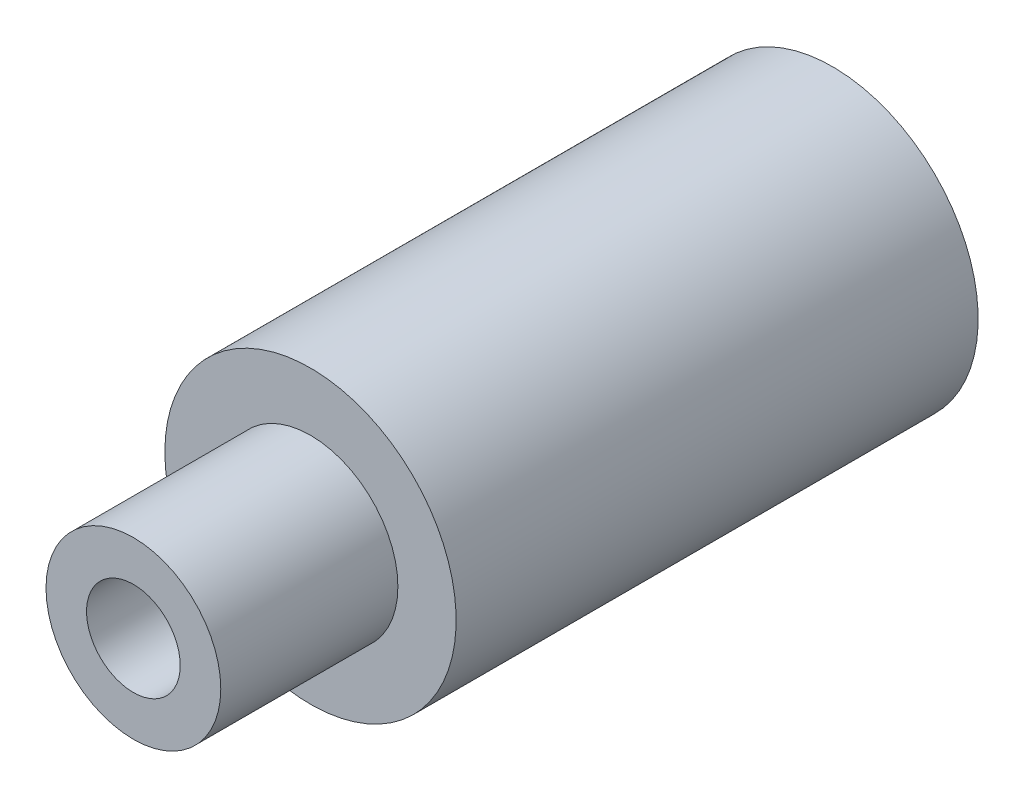
ISO-10303-21;
HEADER;
FILE_DESCRIPTION(('STEP AP214'),'2;1');
FILE_NAME('part.step','',(''),(''),'','','');
FILE_SCHEMA(('AUTOMOTIVE_DESIGN { 1 0 10303 214 1 1 1 1 }'));
ENDSEC;
DATA;
#1=APPLICATION_CONTEXT('core data for automotive mechanical design processes');
#2=APPLICATION_PROTOCOL_DEFINITION('international standard','automotive_design',2000,#1);
#3=PRODUCT_CONTEXT('',#1,'mechanical');
#4=PRODUCT('Part','Part','',(#3));
#5=PRODUCT_RELATED_PRODUCT_CATEGORY('part','',(#4));
#6=PRODUCT_DEFINITION_FORMATION('','',#4);
#7=PRODUCT_DEFINITION_CONTEXT('part definition',#1,'design');
#8=PRODUCT_DEFINITION('design','',#6,#7);
#9=PRODUCT_DEFINITION_SHAPE('','',#8);
#10=(LENGTH_UNIT() NAMED_UNIT(*) SI_UNIT(.MILLI.,.METRE.));
#11=(NAMED_UNIT(*) PLANE_ANGLE_UNIT() SI_UNIT($,.RADIAN.));
#12=(NAMED_UNIT(*) SI_UNIT($,.STERADIAN.) SOLID_ANGLE_UNIT());
#13=UNCERTAINTY_MEASURE_WITH_UNIT(LENGTH_MEASURE(1.E-05),#10,'distance_accuracy_value','');
#14=(GEOMETRIC_REPRESENTATION_CONTEXT(3) GLOBAL_UNCERTAINTY_ASSIGNED_CONTEXT((#13)) GLOBAL_UNIT_ASSIGNED_CONTEXT((#10,
#11,#12)) REPRESENTATION_CONTEXT('',''));
#15=CARTESIAN_POINT('',(0.,0.,0.));
#16=DIRECTION('',(0.,0.,1.));
#17=DIRECTION('',(1.,0.,0.));
#18=AXIS2_PLACEMENT_3D('',#15,#16,#17);
#19=CARTESIAN_POINT('',(0.,0.,38.1));
#20=DIRECTION('',(0.,0.,-1.));
#21=DIRECTION('',(-1.,0.,0.));
#22=AXIS2_PLACEMENT_3D('',#19,#20,#21);
#23=CYLINDRICAL_SURFACE('',#22,7.9375);
#24=CARTESIAN_POINT('',(0.,0.,0.));
#25=DIRECTION('',(0.,0.,1.));
#26=DIRECTION('',(1.,0.,0.));
#27=AXIS2_PLACEMENT_3D('',#24,#25,#26);
#28=CIRCLE('',#27,7.9375);
#29=CARTESIAN_POINT('',(-7.9375,0.,0.));
#30=VERTEX_POINT('',#29);
#31=EDGE_CURVE('E11',#30,#30,#28,.T.);
#32=CARTESIAN_POINT('',(0.,0.,28.448));
#33=DIRECTION('',(0.,0.,1.));
#34=DIRECTION('',(1.,0.,0.));
#35=AXIS2_PLACEMENT_3D('',#32,#33,#34);
#36=CIRCLE('',#35,7.9375);
#37=CARTESIAN_POINT('',(-7.9375,0.,28.448));
#38=VERTEX_POINT('',#37);
#39=EDGE_CURVE('E46',#38,#38,#36,.T.);
#40=CARTESIAN_POINT('',(-7.9375,0.,0.));
#41=CARTESIAN_POINT('',(-7.9375,0.,0.296333333333334));
#42=CARTESIAN_POINT('',(-7.9375,0.,0.592666666666667));
#43=CARTESIAN_POINT('',(-7.9375,0.,1.18533333333333));
#44=CARTESIAN_POINT('',(-7.9375,0.,1.48166666666667));
#45=CARTESIAN_POINT('',(-7.9375,0.,2.07433333333334));
#46=CARTESIAN_POINT('',(-7.9375,0.,2.37066666666667));
#47=CARTESIAN_POINT('',(-7.9375,0.,2.96333333333334));
#48=CARTESIAN_POINT('',(-7.9375,0.,3.25966666666667));
#49=CARTESIAN_POINT('',(-7.9375,0.,3.85233333333334));
#50=CARTESIAN_POINT('',(-7.9375,0.,4.14866666666667));
#51=CARTESIAN_POINT('',(-7.9375,0.,4.74133333333334));
#52=CARTESIAN_POINT('',(-7.9375,0.,5.03766666666667));
#53=CARTESIAN_POINT('',(-7.9375,0.,5.63033333333333));
#54=CARTESIAN_POINT('',(-7.9375,0.,5.92666666666667));
#55=CARTESIAN_POINT('',(-7.9375,0.,6.51933333333333));
#56=CARTESIAN_POINT('',(-7.9375,0.,6.81566666666666));
#57=CARTESIAN_POINT('',(-7.9375,0.,7.40833333333333));
#58=CARTESIAN_POINT('',(-7.9375,0.,7.70466666666666));
#59=CARTESIAN_POINT('',(-7.9375,0.,8.29733333333333));
#60=CARTESIAN_POINT('',(-7.9375,0.,8.59366666666666));
#61=CARTESIAN_POINT('',(-7.9375,0.,9.18633333333333));
#62=CARTESIAN_POINT('',(-7.9375,0.,9.48266666666667));
#63=CARTESIAN_POINT('',(-7.9375,0.,10.0753333333333));
#64=CARTESIAN_POINT('',(-7.9375,0.,10.3716666666667));
#65=CARTESIAN_POINT('',(-7.9375,0.,10.9643333333333));
#66=CARTESIAN_POINT('',(-7.9375,0.,11.2606666666667));
#67=CARTESIAN_POINT('',(-7.9375,0.,11.8533333333333));
#68=CARTESIAN_POINT('',(-7.9375,0.,12.1496666666667));
#69=CARTESIAN_POINT('',(-7.9375,0.,12.7423333333333));
#70=CARTESIAN_POINT('',(-7.9375,0.,13.0386666666667));
#71=CARTESIAN_POINT('',(-7.9375,0.,13.6313333333333));
#72=CARTESIAN_POINT('',(-7.9375,0.,13.9276666666667));
#73=CARTESIAN_POINT('',(-7.9375,0.,14.5203333333333));
#74=CARTESIAN_POINT('',(-7.9375,0.,14.8166666666667));
#75=CARTESIAN_POINT('',(-7.9375,0.,15.4093333333333));
#76=CARTESIAN_POINT('',(-7.9375,0.,15.7056666666667));
#77=CARTESIAN_POINT('',(-7.9375,0.,16.2983333333333));
#78=CARTESIAN_POINT('',(-7.9375,0.,16.5946666666667));
#79=CARTESIAN_POINT('',(-7.9375,0.,17.1873333333333));
#80=CARTESIAN_POINT('',(-7.9375,0.,17.4836666666667));
#81=CARTESIAN_POINT('',(-7.9375,0.,18.0763333333333));
#82=CARTESIAN_POINT('',(-7.9375,0.,18.3726666666667));
#83=CARTESIAN_POINT('',(-7.9375,0.,18.9653333333333));
#84=CARTESIAN_POINT('',(-7.9375,0.,19.2616666666667));
#85=CARTESIAN_POINT('',(-7.9375,0.,19.8543333333333));
#86=CARTESIAN_POINT('',(-7.9375,0.,20.1506666666667));
#87=CARTESIAN_POINT('',(-7.9375,0.,20.7433333333333));
#88=CARTESIAN_POINT('',(-7.9375,0.,21.0396666666667));
#89=CARTESIAN_POINT('',(-7.9375,0.,21.6323333333333));
#90=CARTESIAN_POINT('',(-7.9375,0.,21.9286666666667));
#91=CARTESIAN_POINT('',(-7.9375,0.,22.5213333333333));
#92=CARTESIAN_POINT('',(-7.9375,0.,22.8176666666667));
#93=CARTESIAN_POINT('',(-7.9375,0.,23.4103333333333));
#94=CARTESIAN_POINT('',(-7.9375,0.,23.7066666666667));
#95=CARTESIAN_POINT('',(-7.9375,0.,24.2993333333333));
#96=CARTESIAN_POINT('',(-7.9375,0.,24.5956666666667));
#97=CARTESIAN_POINT('',(-7.9375,0.,25.1883333333333));
#98=CARTESIAN_POINT('',(-7.9375,0.,25.4846666666667));
#99=CARTESIAN_POINT('',(-7.9375,0.,26.0773333333333));
#100=CARTESIAN_POINT('',(-7.9375,0.,26.3736666666667));
#101=CARTESIAN_POINT('',(-7.9375,0.,26.9663333333333));
#102=CARTESIAN_POINT('',(-7.9375,0.,27.2626666666667));
#103=CARTESIAN_POINT('',(-7.9375,0.,27.8553333333333));
#104=CARTESIAN_POINT('',(-7.9375,0.,28.1516666666667));
#105=CARTESIAN_POINT('',(-7.9375,0.,28.448));
#106=B_SPLINE_CURVE_WITH_KNOTS('',3,(#40,#41,#42,#43,#44,#45,#46,#47,#48,#49,#50,#51,#52,#53,
#54,#55,#56,#57,#58,#59,#60,#61,#62,#63,#64,#65,#66,#67,#68,#69,#70,#71,#72,#73,#74,#75,#76,#77,
#78,#79,#80,#81,#82,#83,#84,#85,#86,#87,#88,#89,#90,#91,#92,#93,#94,#95,#96,#97,#98,#99,#100,
#101,#102,#103,#104,#105),.UNSPECIFIED.,.F.,.F.,(4,2,2,2,2,2,2,2,2,2,2,2,2,2,2,2,2,2,2,2,2,2,2,
2,2,2,2,2,2,2,2,2,4),(0.,0.889000000000001,1.778,2.667,3.556,4.445,5.334,6.223,7.112,8.001,8.89,
9.779,10.668,11.557,12.446,13.335,14.224,15.113,16.002,16.891,17.78,18.669,19.558,20.447,21.336,
22.225,23.114,24.003,24.892,25.781,26.67,27.559,28.448),.UNSPECIFIED.);
#107=EDGE_CURVE('BSEAM43',#30,#38,#106,.T.);
#108=ORIENTED_EDGE('',*,*,#31,.T.);
#109=ORIENTED_EDGE('',*,*,#39,.F.);
#110=ORIENTED_EDGE('',*,*,#107,.T.);
#111=ORIENTED_EDGE('',*,*,#107,.F.);
#112=EDGE_LOOP('',(#108,#110,#109,#111));
#113=FACE_BOUND('',#112,.T.);
#114=ADVANCED_FACE('F43',(#113),#23,.T.);
#115=CARTESIAN_POINT('',(0.,0.,0.));
#116=DIRECTION('',(0.,0.,1.));
#117=DIRECTION('',(1.,0.,0.));
#118=AXIS2_PLACEMENT_3D('',#115,#116,#117);
#119=PLANE('',#118);
#120=CARTESIAN_POINT('',(0.,0.,0.));
#121=DIRECTION('',(0.,0.,-1.));
#122=DIRECTION('',(-1.,0.,0.));
#123=AXIS2_PLACEMENT_3D('',#120,#121,#122);
#124=CIRCLE('',#123,2.55269999999999);
#125=CARTESIAN_POINT('',(-2.55269999999999,0.,0.));
#126=VERTEX_POINT('',#125);
#127=EDGE_CURVE('E74',#126,#126,#124,.T.);
#128=ORIENTED_EDGE('',*,*,#127,.F.);
#129=EDGE_LOOP('',(#128));
#130=FACE_BOUND('',#129,.T.);
#131=ORIENTED_EDGE('',*,*,#31,.F.);
#132=EDGE_LOOP('',(#131));
#133=FACE_BOUND('',#132,.T.);
#134=ADVANCED_FACE('F86',(#130,#133),#119,.F.);
#135=CARTESIAN_POINT('',(0.,0.,28.448));
#136=DIRECTION('',(0.,0.,1.));
#137=DIRECTION('',(1.,0.,0.));
#138=AXIS2_PLACEMENT_3D('',#135,#136,#137);
#139=PLANE('',#138);
#140=CARTESIAN_POINT('',(0.,0.,28.448));
#141=DIRECTION('',(0.,0.,1.));
#142=DIRECTION('',(1.,0.,0.));
#143=AXIS2_PLACEMENT_3D('',#140,#141,#142);
#144=CIRCLE('',#143,4.7625);
#145=CARTESIAN_POINT('',(-4.7625,0.,28.448));
#146=VERTEX_POINT('',#145);
#147=EDGE_CURVE('E59',#146,#146,#144,.T.);
#148=ORIENTED_EDGE('',*,*,#147,.F.);
#149=EDGE_LOOP('',(#148));
#150=FACE_BOUND('',#149,.T.);
#151=ORIENTED_EDGE('',*,*,#39,.T.);
#152=EDGE_LOOP('',(#151));
#153=FACE_BOUND('',#152,.T.);
#154=ADVANCED_FACE('F89',(#150,#153),#139,.T.);
#155=CARTESIAN_POINT('',(0.,0.,38.100012));
#156=DIRECTION('',(0.,0.,-1.));
#157=DIRECTION('',(-1.,0.,0.));
#158=AXIS2_PLACEMENT_3D('',#155,#156,#157);
#159=CYLINDRICAL_SURFACE('',#158,4.7625);
#160=CARTESIAN_POINT('',(0.,0.,38.1));
#161=DIRECTION('',(0.,0.,1.));
#162=DIRECTION('',(1.,0.,0.));
#163=AXIS2_PLACEMENT_3D('',#160,#161,#162);
#164=CIRCLE('',#163,4.7625);
#165=CARTESIAN_POINT('',(-4.7625,0.,38.1));
#166=VERTEX_POINT('',#165);
#167=EDGE_CURVE('E57',#166,#166,#164,.F.);
#168=CARTESIAN_POINT('',(-4.7625,0.,38.1));
#169=CARTESIAN_POINT('',(-4.7625,0.,37.9994583333333));
#170=CARTESIAN_POINT('',(-4.7625,0.,37.8989166666667));
#171=CARTESIAN_POINT('',(-4.7625,0.,37.6978333333333));
#172=CARTESIAN_POINT('',(-4.7625,0.,37.5972916666667));
#173=CARTESIAN_POINT('',(-4.7625,0.,37.3962083333333));
#174=CARTESIAN_POINT('',(-4.7625,0.,37.2956666666667));
#175=CARTESIAN_POINT('',(-4.7625,0.,37.0945833333333));
#176=CARTESIAN_POINT('',(-4.7625,0.,36.9940416666667));
#177=CARTESIAN_POINT('',(-4.7625,0.,36.7929583333333));
#178=CARTESIAN_POINT('',(-4.7625,0.,36.6924166666667));
#179=CARTESIAN_POINT('',(-4.7625,0.,36.4913333333333));
#180=CARTESIAN_POINT('',(-4.7625,0.,36.3907916666667));
#181=CARTESIAN_POINT('',(-4.7625,0.,36.1897083333333));
#182=CARTESIAN_POINT('',(-4.7625,0.,36.0891666666667));
#183=CARTESIAN_POINT('',(-4.7625,0.,35.8880833333333));
#184=CARTESIAN_POINT('',(-4.7625,0.,35.7875416666667));
#185=CARTESIAN_POINT('',(-4.7625,0.,35.5864583333333));
#186=CARTESIAN_POINT('',(-4.7625,0.,35.4859166666667));
#187=CARTESIAN_POINT('',(-4.7625,0.,35.2848333333333));
#188=CARTESIAN_POINT('',(-4.7625,0.,35.1842916666667));
#189=CARTESIAN_POINT('',(-4.7625,0.,34.9832083333333));
#190=CARTESIAN_POINT('',(-4.7625,0.,34.8826666666667));
#191=CARTESIAN_POINT('',(-4.7625,0.,34.6815833333333));
#192=CARTESIAN_POINT('',(-4.7625,0.,34.5810416666667));
#193=CARTESIAN_POINT('',(-4.7625,0.,34.3799583333333));
#194=CARTESIAN_POINT('',(-4.7625,0.,34.2794166666667));
#195=CARTESIAN_POINT('',(-4.7625,0.,34.0783333333333));
#196=CARTESIAN_POINT('',(-4.7625,0.,33.9777916666667));
#197=CARTESIAN_POINT('',(-4.7625,0.,33.7767083333333));
#198=CARTESIAN_POINT('',(-4.7625,0.,33.6761666666667));
#199=CARTESIAN_POINT('',(-4.7625,0.,33.4750833333333));
#200=CARTESIAN_POINT('',(-4.7625,0.,33.3745416666667));
#201=CARTESIAN_POINT('',(-4.7625,0.,33.1734583333333));
#202=CARTESIAN_POINT('',(-4.7625,0.,33.0729166666667));
#203=CARTESIAN_POINT('',(-4.7625,0.,32.8718333333333));
#204=CARTESIAN_POINT('',(-4.7625,0.,32.7712916666667));
#205=CARTESIAN_POINT('',(-4.7625,0.,32.5702083333333));
#206=CARTESIAN_POINT('',(-4.7625,0.,32.4696666666667));
#207=CARTESIAN_POINT('',(-4.7625,0.,32.2685833333333));
#208=CARTESIAN_POINT('',(-4.7625,0.,32.1680416666667));
#209=CARTESIAN_POINT('',(-4.7625,0.,31.9669583333333));
#210=CARTESIAN_POINT('',(-4.7625,0.,31.8664166666667));
#211=CARTESIAN_POINT('',(-4.7625,0.,31.6653333333333));
#212=CARTESIAN_POINT('',(-4.7625,0.,31.5647916666667));
#213=CARTESIAN_POINT('',(-4.7625,0.,31.3637083333333));
#214=CARTESIAN_POINT('',(-4.7625,0.,31.2631666666667));
#215=CARTESIAN_POINT('',(-4.7625,0.,31.0620833333333));
#216=CARTESIAN_POINT('',(-4.7625,0.,30.9615416666667));
#217=CARTESIAN_POINT('',(-4.7625,0.,30.7604583333333));
#218=CARTESIAN_POINT('',(-4.7625,0.,30.6599166666667));
#219=CARTESIAN_POINT('',(-4.7625,0.,30.4588333333333));
#220=CARTESIAN_POINT('',(-4.7625,0.,30.3582916666667));
#221=CARTESIAN_POINT('',(-4.7625,0.,30.1572083333333));
#222=CARTESIAN_POINT('',(-4.7625,0.,30.0566666666667));
#223=CARTESIAN_POINT('',(-4.7625,0.,29.8555833333333));
#224=CARTESIAN_POINT('',(-4.7625,0.,29.7550416666667));
#225=CARTESIAN_POINT('',(-4.7625,0.,29.5539583333333));
#226=CARTESIAN_POINT('',(-4.7625,0.,29.4534166666667));
#227=CARTESIAN_POINT('',(-4.7625,0.,29.2523333333333));
#228=CARTESIAN_POINT('',(-4.7625,0.,29.1517916666667));
#229=CARTESIAN_POINT('',(-4.7625,0.,28.9507083333333));
#230=CARTESIAN_POINT('',(-4.7625,0.,28.8501666666667));
#231=CARTESIAN_POINT('',(-4.7625,0.,28.6490833333333));
#232=CARTESIAN_POINT('',(-4.7625,0.,28.5485416666667));
#233=CARTESIAN_POINT('',(-4.7625,0.,28.448));
#234=B_SPLINE_CURVE_WITH_KNOTS('',3,(#168,#169,#170,#171,#172,#173,#174,#175,#176,#177,#178,
#179,#180,#181,#182,#183,#184,#185,#186,#187,#188,#189,#190,#191,#192,#193,#194,#195,#196,#197,
#198,#199,#200,#201,#202,#203,#204,#205,#206,#207,#208,#209,#210,#211,#212,#213,#214,#215,#216,
#217,#218,#219,#220,#221,#222,#223,#224,#225,#226,#227,#228,#229,#230,#231,#232,#233),
.UNSPECIFIED.,.F.,.F.,(4,2,2,2,2,2,2,2,2,2,2,2,2,2,2,2,2,2,2,2,2,2,2,2,2,2,2,2,2,2,2,2,4),(0.,
0.301625000000007,0.603250000000007,0.904875000000006,1.20650000000001,1.50812500000001,
1.80975000000001,2.11137500000001,2.41300000000001,2.71462500000001,3.01625000000001,3.317875,
3.6195,3.921125,4.22275,4.524375,4.826,5.127625,5.42925,5.730875,6.0325,6.334125,6.63575,
6.937375,7.239,7.540625,7.84225,8.143875,8.4455,8.747125,9.04875,9.350375,9.652),.UNSPECIFIED.);
#235=EDGE_CURVE('BSEAM94',#166,#146,#234,.T.);
#236=ORIENTED_EDGE('',*,*,#167,.T.);
#237=ORIENTED_EDGE('',*,*,#147,.T.);
#238=ORIENTED_EDGE('',*,*,#235,.T.);
#239=ORIENTED_EDGE('',*,*,#235,.F.);
#240=EDGE_LOOP('',(#236,#238,#237,#239));
#241=FACE_BOUND('',#240,.T.);
#242=ADVANCED_FACE('F94',(#241),#159,.T.);
#243=CARTESIAN_POINT('',(0.,0.,38.1));
#244=DIRECTION('',(0.,0.,1.));
#245=DIRECTION('',(1.,0.,0.));
#246=AXIS2_PLACEMENT_3D('',#243,#244,#245);
#247=PLANE('',#246);
#248=CARTESIAN_POINT('',(0.,0.,38.1));
#249=DIRECTION('',(0.,0.,1.));
#250=DIRECTION('',(1.,0.,0.));
#251=AXIS2_PLACEMENT_3D('',#248,#249,#250);
#252=CIRCLE('',#251,2.55269999999999);
#253=CARTESIAN_POINT('',(2.55269999999999,0.,38.1));
#254=VERTEX_POINT('',#253);
#255=EDGE_CURVE('E68',#254,#254,#252,.T.);
#256=ORIENTED_EDGE('',*,*,#255,.F.);
#257=EDGE_LOOP('',(#256));
#258=FACE_BOUND('',#257,.T.);
#259=ORIENTED_EDGE('',*,*,#167,.F.);
#260=EDGE_LOOP('',(#259));
#261=FACE_BOUND('',#260,.T.);
#262=ADVANCED_FACE('F98',(#258,#261),#247,.T.);
#263=CARTESIAN_POINT('',(0.,0.,38.1));
#264=DIRECTION('',(0.,0.,1.));
#265=DIRECTION('',(1.,0.,0.));
#266=AXIS2_PLACEMENT_3D('',#263,#264,#265);
#267=CYLINDRICAL_SURFACE('',#266,2.55269999999999);
#268=ORIENTED_EDGE('',*,*,#255,.T.);
#269=EDGE_LOOP('',(#268));
#270=FACE_BOUND('',#269,.T.);
#271=ORIENTED_EDGE('',*,*,#127,.T.);
#272=EDGE_LOOP('',(#271));
#273=FACE_BOUND('',#272,.T.);
#274=ADVANCED_FACE('F84',(#270,#273),#267,.F.);
#275=CLOSED_SHELL('',(#114,#134,#154,#242,#262,#274));
#276=MANIFOLD_SOLID_BREP('B2',#275);
#277=ADVANCED_BREP_SHAPE_REPRESENTATION('',(#18,#276),#14);
#278=SHAPE_DEFINITION_REPRESENTATION(#9,#277);
ENDSEC;
END-ISO-10303-21;
